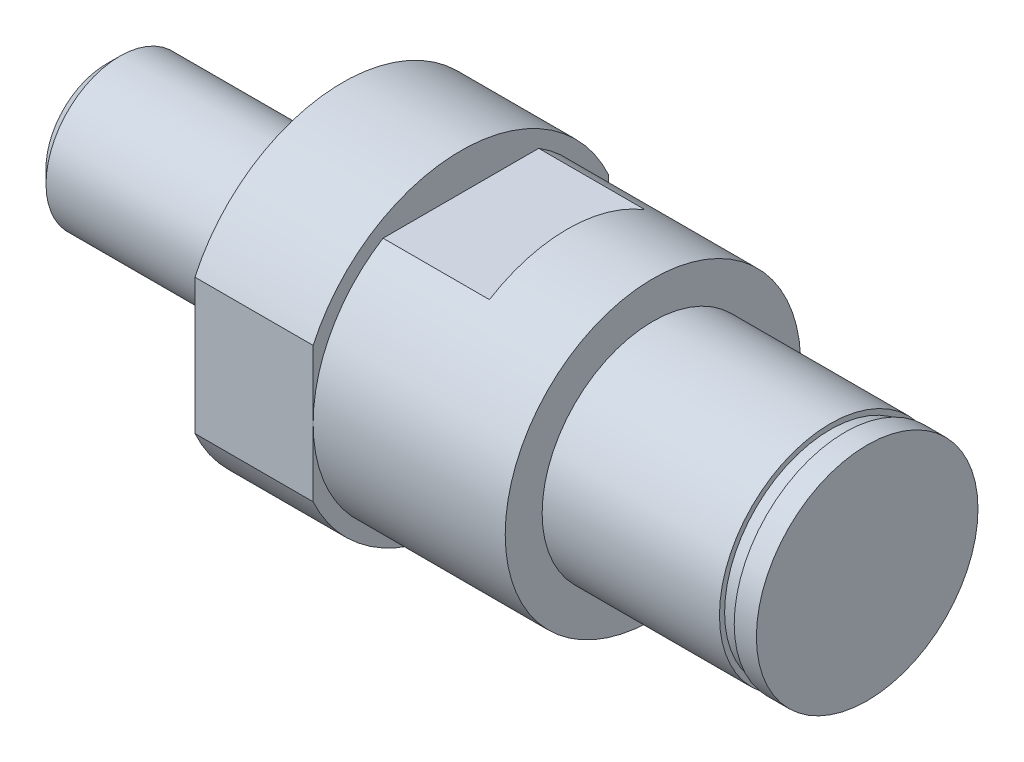
ISO-10303-21;
HEADER;
FILE_DESCRIPTION(('STEP AP214'),'2;1');
FILE_NAME('part.step','',(''),(''),'','','');
FILE_SCHEMA(('AUTOMOTIVE_DESIGN { 1 0 10303 214 1 1 1 1 }'));
ENDSEC;
DATA;
#1=APPLICATION_CONTEXT('core data for automotive mechanical design processes');
#2=APPLICATION_PROTOCOL_DEFINITION('international standard','automotive_design',2000,#1);
#3=PRODUCT_CONTEXT('',#1,'mechanical');
#4=PRODUCT('Part','Part','',(#3));
#5=PRODUCT_RELATED_PRODUCT_CATEGORY('part','',(#4));
#6=PRODUCT_DEFINITION_FORMATION('','',#4);
#7=PRODUCT_DEFINITION_CONTEXT('part definition',#1,'design');
#8=PRODUCT_DEFINITION('design','',#6,#7);
#9=PRODUCT_DEFINITION_SHAPE('','',#8);
#10=(LENGTH_UNIT() NAMED_UNIT(*) SI_UNIT(.MILLI.,.METRE.));
#11=(NAMED_UNIT(*) PLANE_ANGLE_UNIT() SI_UNIT($,.RADIAN.));
#12=(NAMED_UNIT(*) SI_UNIT($,.STERADIAN.) SOLID_ANGLE_UNIT());
#13=UNCERTAINTY_MEASURE_WITH_UNIT(LENGTH_MEASURE(1.E-05),#10,'distance_accuracy_value','');
#14=(GEOMETRIC_REPRESENTATION_CONTEXT(3) GLOBAL_UNCERTAINTY_ASSIGNED_CONTEXT((#13)) GLOBAL_UNIT_ASSIGNED_CONTEXT((#10,
#11,#12)) REPRESENTATION_CONTEXT('',''));
#15=CARTESIAN_POINT('',(0.,0.,0.));
#16=DIRECTION('',(0.,0.,1.));
#17=DIRECTION('',(1.,0.,0.));
#18=AXIS2_PLACEMENT_3D('',#15,#16,#17);
#19=CARTESIAN_POINT('',(51.5,7.5,0.));
#20=DIRECTION('',(-1.,0.,0.));
#21=DIRECTION('',(0.,0.,1.));
#22=AXIS2_PLACEMENT_3D('',#19,#20,#21);
#23=PLANE('',#22);
#24=CARTESIAN_POINT('',(51.5,0.,0.));
#25=DIRECTION('',(-1.,0.,0.));
#26=DIRECTION('',(0.,0.,1.));
#27=AXIS2_PLACEMENT_3D('',#24,#25,#26);
#28=CIRCLE('',#27,7.5);
#29=CARTESIAN_POINT('',(51.5,0.,7.5));
#30=VERTEX_POINT('',#29);
#31=EDGE_CURVE('E20',#30,#30,#28,.T.);
#32=ORIENTED_EDGE('',*,*,#31,.F.);
#33=EDGE_LOOP('',(#32));
#34=FACE_BOUND('',#33,.T.);
#35=ADVANCED_FACE('F17',(#34),#23,.F.);
#36=CARTESIAN_POINT('',(0.,0.,0.));
#37=DIRECTION('',(1.,0.,0.));
#38=DIRECTION('',(0.,0.,-1.));
#39=AXIS2_PLACEMENT_3D('',#36,#37,#38);
#40=PLANE('',#39);
#41=CARTESIAN_POINT('',(0.,0.,0.));
#42=DIRECTION('',(1.,0.,0.));
#43=DIRECTION('',(0.,1.,0.));
#44=AXIS2_PLACEMENT_3D('',#41,#42,#43);
#45=CIRCLE('',#44,4.07999999993081);
#46=CARTESIAN_POINT('',(0.,4.07999999993081,0.));
#47=VERTEX_POINT('',#46);
#48=EDGE_CURVE('E145',#47,#47,#45,.T.);
#49=ORIENTED_EDGE('',*,*,#48,.F.);
#50=EDGE_LOOP('',(#49));
#51=FACE_BOUND('',#50,.T.);
#52=ADVANCED_FACE('F156',(#51),#40,.F.);
#53=CARTESIAN_POINT('',(51.5,0.,0.));
#54=DIRECTION('',(-1.,0.,0.));
#55=DIRECTION('',(0.,0.,1.));
#56=AXIS2_PLACEMENT_3D('',#53,#54,#55);
#57=CYLINDRICAL_SURFACE('',#56,7.5);
#58=ORIENTED_EDGE('',*,*,#31,.T.);
#59=EDGE_LOOP('',(#58));
#60=FACE_BOUND('',#59,.T.);
#61=CARTESIAN_POINT('',(50.,0.,0.));
#62=DIRECTION('',(-1.,0.,0.));
#63=DIRECTION('',(0.,0.,1.));
#64=AXIS2_PLACEMENT_3D('',#61,#62,#63);
#65=CIRCLE('',#64,7.5);
#66=CARTESIAN_POINT('',(50.,0.,7.5));
#67=VERTEX_POINT('',#66);
#68=EDGE_CURVE('E98',#67,#67,#65,.F.);
#69=ORIENTED_EDGE('',*,*,#68,.T.);
#70=EDGE_LOOP('',(#69));
#71=FACE_BOUND('',#70,.T.);
#72=ADVANCED_FACE('F152',(#60,#71),#57,.T.);
#73=CARTESIAN_POINT('',(0.920000000007803,0.,0.));
#74=DIRECTION('',(1.,0.,0.));
#75=DIRECTION('',(0.,1.,0.));
#76=AXIS2_PLACEMENT_3D('',#73,#74,#75);
#77=CONICAL_SURFACE('',#76,4.99999999993861,0.785398163397448);
#78=CARTESIAN_POINT('',(0.919999999999997,0.,0.));
#79=DIRECTION('',(-1.,0.,0.));
#80=DIRECTION('',(0.,0.,1.));
#81=AXIS2_PLACEMENT_3D('',#78,#79,#80);
#82=CIRCLE('',#81,5.);
#83=CARTESIAN_POINT('',(0.919999999999997,0.,5.));
#84=VERTEX_POINT('',#83);
#85=EDGE_CURVE('E95',#84,#84,#82,.F.);
#86=ORIENTED_EDGE('',*,*,#85,.F.);
#87=EDGE_LOOP('',(#86));
#88=FACE_BOUND('',#87,.T.);
#89=ORIENTED_EDGE('',*,*,#48,.T.);
#90=EDGE_LOOP('',(#89));
#91=FACE_BOUND('',#90,.T.);
#92=ADVANCED_FACE('F232',(#88,#91),#77,.T.);
#93=CARTESIAN_POINT('',(50.,7.15,0.));
#94=DIRECTION('',(1.,0.,0.));
#95=DIRECTION('',(0.,0.,-1.));
#96=AXIS2_PLACEMENT_3D('',#93,#94,#95);
#97=PLANE('',#96);
#98=ORIENTED_EDGE('',*,*,#68,.F.);
#99=EDGE_LOOP('',(#98));
#100=FACE_BOUND('',#99,.T.);
#101=CARTESIAN_POINT('',(50.,0.,0.));
#102=DIRECTION('',(-1.,0.,0.));
#103=DIRECTION('',(0.,0.,1.));
#104=AXIS2_PLACEMENT_3D('',#101,#102,#103);
#105=CIRCLE('',#104,7.15);
#106=CARTESIAN_POINT('',(50.,0.,7.15));
#107=VERTEX_POINT('',#106);
#108=EDGE_CURVE('E97',#107,#107,#105,.T.);
#109=ORIENTED_EDGE('',*,*,#108,.F.);
#110=EDGE_LOOP('',(#109));
#111=FACE_BOUND('',#110,.T.);
#112=ADVANCED_FACE('F228',(#100,#111),#97,.F.);
#113=CARTESIAN_POINT('',(56.5,0.,0.));
#114=DIRECTION('',(-1.,0.,0.));
#115=DIRECTION('',(0.,0.,1.));
#116=AXIS2_PLACEMENT_3D('',#113,#114,#115);
#117=CYLINDRICAL_SURFACE('',#116,5.);
#118=CARTESIAN_POINT('',(16.,0.,0.));
#119=DIRECTION('',(-1.,0.,0.));
#120=DIRECTION('',(0.,0.,1.));
#121=AXIS2_PLACEMENT_3D('',#118,#119,#120);
#122=CIRCLE('',#121,5.);
#123=CARTESIAN_POINT('',(16.,0.,5.));
#124=VERTEX_POINT('',#123);
#125=EDGE_CURVE('E139',#124,#124,#122,.T.);
#126=ORIENTED_EDGE('',*,*,#125,.T.);
#127=EDGE_LOOP('',(#126));
#128=FACE_BOUND('',#127,.T.);
#129=ORIENTED_EDGE('',*,*,#85,.T.);
#130=EDGE_LOOP('',(#129));
#131=FACE_BOUND('',#130,.T.);
#132=ADVANCED_FACE('F224',(#128,#131),#117,.T.);
#133=CARTESIAN_POINT('',(51.5,0.,0.));
#134=DIRECTION('',(-1.,0.,0.));
#135=DIRECTION('',(0.,0.,1.));
#136=AXIS2_PLACEMENT_3D('',#133,#134,#135);
#137=CYLINDRICAL_SURFACE('',#136,7.15);
#138=ORIENTED_EDGE('',*,*,#108,.T.);
#139=EDGE_LOOP('',(#138));
#140=FACE_BOUND('',#139,.T.);
#141=CARTESIAN_POINT('',(49.,0.,0.));
#142=DIRECTION('',(-1.,0.,0.));
#143=DIRECTION('',(0.,0.,1.));
#144=AXIS2_PLACEMENT_3D('',#141,#142,#143);
#145=CIRCLE('',#144,7.15);
#146=CARTESIAN_POINT('',(49.,0.,7.15));
#147=VERTEX_POINT('',#146);
#148=EDGE_CURVE('E79',#147,#147,#145,.F.);
#149=ORIENTED_EDGE('',*,*,#148,.T.);
#150=EDGE_LOOP('',(#149));
#151=FACE_BOUND('',#150,.T.);
#152=ADVANCED_FACE('F220',(#140,#151),#137,.T.);
#153=CARTESIAN_POINT('',(16.,5.,0.));
#154=DIRECTION('',(1.,0.,0.));
#155=DIRECTION('',(0.,0.,-1.));
#156=AXIS2_PLACEMENT_3D('',#153,#154,#155);
#157=PLANE('',#156);
#158=ORIENTED_EDGE('',*,*,#125,.F.);
#159=EDGE_LOOP('',(#158));
#160=FACE_BOUND('',#159,.T.);
#161=DIRECTION('',(0.,1.,0.));
#162=VECTOR('',#161,1.);
#163=CARTESIAN_POINT('',(16.,-4.58257569495584,-10.));
#164=LINE('',#163,#162);
#165=CARTESIAN_POINT('',(16.,-4.58257569495584,-10.));
#166=VERTEX_POINT('',#165);
#167=CARTESIAN_POINT('',(16.,4.58257569495584,-10.));
#168=VERTEX_POINT('',#167);
#169=EDGE_CURVE('E73',#166,#168,#164,.T.);
#170=ORIENTED_EDGE('',*,*,#169,.F.);
#171=CARTESIAN_POINT('',(16.,0.,0.));
#172=DIRECTION('',(-1.,0.,0.));
#173=DIRECTION('',(0.,0.,1.));
#174=AXIS2_PLACEMENT_3D('',#171,#172,#173);
#175=CIRCLE('',#174,11.);
#176=CARTESIAN_POINT('',(16.,-4.58257569495584,10.));
#177=VERTEX_POINT('',#176);
#178=EDGE_CURVE('E85',#177,#166,#175,.F.);
#179=ORIENTED_EDGE('',*,*,#178,.F.);
#180=DIRECTION('',(0.,1.,0.));
#181=VECTOR('',#180,1.);
#182=CARTESIAN_POINT('',(16.,4.58257569495584,10.));
#183=LINE('',#182,#181);
#184=CARTESIAN_POINT('',(16.,4.58257569495584,10.));
#185=VERTEX_POINT('',#184);
#186=EDGE_CURVE('E76',#185,#177,#183,.F.);
#187=ORIENTED_EDGE('',*,*,#186,.F.);
#188=CARTESIAN_POINT('',(16.,0.,0.));
#189=DIRECTION('',(-1.,0.,0.));
#190=DIRECTION('',(0.,0.,1.));
#191=AXIS2_PLACEMENT_3D('',#188,#189,#190);
#192=CIRCLE('',#191,11.);
#193=EDGE_CURVE('E69',#168,#185,#192,.F.);
#194=ORIENTED_EDGE('',*,*,#193,.F.);
#195=EDGE_LOOP('',(#170,#179,#187,#194));
#196=FACE_BOUND('',#195,.T.);
#197=ADVANCED_FACE('F71',(#160,#196),#157,.F.);
#198=CARTESIAN_POINT('',(49.,7.5,0.));
#199=DIRECTION('',(-1.,0.,0.));
#200=DIRECTION('',(0.,0.,1.));
#201=AXIS2_PLACEMENT_3D('',#198,#199,#200);
#202=PLANE('',#201);
#203=CARTESIAN_POINT('',(49.,0.,0.));
#204=DIRECTION('',(-1.,0.,0.));
#205=DIRECTION('',(0.,0.,1.));
#206=AXIS2_PLACEMENT_3D('',#203,#204,#205);
#207=CIRCLE('',#206,7.5);
#208=CARTESIAN_POINT('',(49.,0.,7.5));
#209=VERTEX_POINT('',#208);
#210=EDGE_CURVE('E131',#209,#209,#207,.T.);
#211=ORIENTED_EDGE('',*,*,#210,.F.);
#212=EDGE_LOOP('',(#211));
#213=FACE_BOUND('',#212,.T.);
#214=ORIENTED_EDGE('',*,*,#148,.F.);
#215=EDGE_LOOP('',(#214));
#216=FACE_BOUND('',#215,.T.);
#217=ADVANCED_FACE('F214',(#213,#216),#202,.F.);
#218=CARTESIAN_POINT('',(56.5,0.,0.));
#219=DIRECTION('',(-1.,0.,0.));
#220=DIRECTION('',(0.,0.,1.));
#221=AXIS2_PLACEMENT_3D('',#218,#219,#220);
#222=CYLINDRICAL_SURFACE('',#221,11.);
#223=DIRECTION('',(1.,0.,0.));
#224=VECTOR('',#223,1.);
#225=CARTESIAN_POINT('',(16.,4.58257569495584,10.));
#226=LINE('',#225,#224);
#227=CARTESIAN_POINT('',(24.,4.58257569495584,10.));
#228=VERTEX_POINT('',#227);
#229=EDGE_CURVE('E389',#228,#185,#226,.F.);
#230=ORIENTED_EDGE('',*,*,#229,.F.);
#231=CARTESIAN_POINT('',(24.,0.,0.));
#232=DIRECTION('',(-1.,0.,0.));
#233=DIRECTION('',(0.,0.,1.));
#234=AXIS2_PLACEMENT_3D('',#231,#232,#233);
#235=CIRCLE('',#234,11.);
#236=CARTESIAN_POINT('',(24.,4.58257569495584,-10.));
#237=VERTEX_POINT('',#236);
#238=EDGE_CURVE('E84',#228,#237,#235,.T.);
#239=ORIENTED_EDGE('',*,*,#238,.T.);
#240=DIRECTION('',(-1.,0.,0.));
#241=VECTOR('',#240,1.);
#242=CARTESIAN_POINT('',(16.,4.58257569495584,-10.));
#243=LINE('',#242,#241);
#244=EDGE_CURVE('E81',#168,#237,#243,.F.);
#245=ORIENTED_EDGE('',*,*,#244,.F.);
#246=ORIENTED_EDGE('',*,*,#193,.T.);
#247=EDGE_LOOP('',(#230,#239,#245,#246));
#248=FACE_BOUND('',#247,.T.);
#249=ADVANCED_FACE('F82',(#248),#222,.T.);
#250=CARTESIAN_POINT('',(16.,-4.58257569495584,-10.));
#251=DIRECTION('',(0.,0.,-1.));
#252=DIRECTION('',(-1.,0.,0.));
#253=AXIS2_PLACEMENT_3D('',#250,#251,#252);
#254=PLANE('',#253);
#255=ORIENTED_EDGE('',*,*,#244,.T.);
#256=DIRECTION('',(0.,1.,0.));
#257=VECTOR('',#256,1.);
#258=CARTESIAN_POINT('',(24.,11.,-10.));
#259=LINE('',#258,#257);
#260=CARTESIAN_POINT('',(24.,0.,-10.));
#261=VERTEX_POINT('',#260);
#262=EDGE_CURVE('E35',#237,#261,#259,.F.);
#263=ORIENTED_EDGE('',*,*,#262,.T.);
#264=DIRECTION('',(0.,1.,0.));
#265=VECTOR('',#264,1.);
#266=CARTESIAN_POINT('',(24.,11.,-10.));
#267=LINE('',#266,#265);
#268=CARTESIAN_POINT('',(24.,-4.58257569495584,-10.));
#269=VERTEX_POINT('',#268);
#270=EDGE_CURVE('E128',#261,#269,#267,.F.);
#271=ORIENTED_EDGE('',*,*,#270,.T.);
#272=DIRECTION('',(-1.,0.,0.));
#273=VECTOR('',#272,1.);
#274=CARTESIAN_POINT('',(56.5,-4.58257569495584,-10.));
#275=LINE('',#274,#273);
#276=EDGE_CURVE('E89',#166,#269,#275,.F.);
#277=ORIENTED_EDGE('',*,*,#276,.F.);
#278=ORIENTED_EDGE('',*,*,#169,.T.);
#279=EDGE_LOOP('',(#255,#263,#271,#277,#278));
#280=FACE_BOUND('',#279,.T.);
#281=ADVANCED_FACE('F87',(#280),#254,.T.);
#282=CARTESIAN_POINT('',(56.5,0.,0.));
#283=DIRECTION('',(-1.,0.,0.));
#284=DIRECTION('',(0.,0.,1.));
#285=AXIS2_PLACEMENT_3D('',#282,#283,#284);
#286=CYLINDRICAL_SURFACE('',#285,11.);
#287=ORIENTED_EDGE('',*,*,#276,.T.);
#288=CARTESIAN_POINT('',(24.,0.,0.));
#289=DIRECTION('',(-1.,0.,0.));
#290=DIRECTION('',(0.,0.,1.));
#291=AXIS2_PLACEMENT_3D('',#288,#289,#290);
#292=CIRCLE('',#291,11.);
#293=CARTESIAN_POINT('',(24.,-4.58257569495584,10.));
#294=VERTEX_POINT('',#293);
#295=EDGE_CURVE('E125',#269,#294,#292,.T.);
#296=ORIENTED_EDGE('',*,*,#295,.T.);
#297=DIRECTION('',(1.,0.,0.));
#298=VECTOR('',#297,1.);
#299=CARTESIAN_POINT('',(16.,-4.58257569495584,10.));
#300=LINE('',#299,#298);
#301=EDGE_CURVE('E135',#177,#294,#300,.T.);
#302=ORIENTED_EDGE('',*,*,#301,.F.);
#303=ORIENTED_EDGE('',*,*,#178,.T.);
#304=EDGE_LOOP('',(#287,#296,#302,#303));
#305=FACE_BOUND('',#304,.T.);
#306=ADVANCED_FACE('F205',(#305),#286,.T.);
#307=CARTESIAN_POINT('',(16.,4.58257569495584,10.));
#308=DIRECTION('',(0.,0.,1.));
#309=DIRECTION('',(1.,0.,0.));
#310=AXIS2_PLACEMENT_3D('',#307,#308,#309);
#311=PLANE('',#310);
#312=ORIENTED_EDGE('',*,*,#301,.T.);
#313=DIRECTION('',(0.,1.,0.));
#314=VECTOR('',#313,1.);
#315=CARTESIAN_POINT('',(24.,11.,10.));
#316=LINE('',#315,#314);
#317=CARTESIAN_POINT('',(24.,0.,10.));
#318=VERTEX_POINT('',#317);
#319=EDGE_CURVE('E127',#294,#318,#316,.T.);
#320=ORIENTED_EDGE('',*,*,#319,.T.);
#321=DIRECTION('',(0.,1.,0.));
#322=VECTOR('',#321,1.);
#323=CARTESIAN_POINT('',(24.,11.,10.));
#324=LINE('',#323,#322);
#325=EDGE_CURVE('E130',#318,#228,#324,.T.);
#326=ORIENTED_EDGE('',*,*,#325,.T.);
#327=ORIENTED_EDGE('',*,*,#229,.T.);
#328=ORIENTED_EDGE('',*,*,#186,.T.);
#329=EDGE_LOOP('',(#312,#320,#326,#327,#328));
#330=FACE_BOUND('',#329,.T.);
#331=ADVANCED_FACE('F201',(#330),#311,.T.);
#332=CARTESIAN_POINT('',(56.5,0.,0.));
#333=DIRECTION('',(-1.,0.,0.));
#334=DIRECTION('',(0.,0.,1.));
#335=AXIS2_PLACEMENT_3D('',#332,#333,#334);
#336=CYLINDRICAL_SURFACE('',#335,7.5);
#337=ORIENTED_EDGE('',*,*,#210,.T.);
#338=EDGE_LOOP('',(#337));
#339=FACE_BOUND('',#338,.T.);
#340=CARTESIAN_POINT('',(37.,0.,0.));
#341=DIRECTION('',(-1.,0.,0.));
#342=DIRECTION('',(0.,0.,1.));
#343=AXIS2_PLACEMENT_3D('',#340,#341,#342);
#344=CIRCLE('',#343,7.5);
#345=CARTESIAN_POINT('',(37.,0.,7.5));
#346=VERTEX_POINT('',#345);
#347=EDGE_CURVE('E121',#346,#346,#344,.F.);
#348=ORIENTED_EDGE('',*,*,#347,.T.);
#349=EDGE_LOOP('',(#348));
#350=FACE_BOUND('',#349,.T.);
#351=ADVANCED_FACE('F197',(#339,#350),#336,.T.);
#352=CARTESIAN_POINT('',(31.2,8.5,10.));
#353=DIRECTION('',(-1.,0.,0.));
#354=DIRECTION('',(0.,0.,1.));
#355=AXIS2_PLACEMENT_3D('',#352,#353,#354);
#356=PLANE('',#355);
#357=DIRECTION('',(0.,0.,1.));
#358=VECTOR('',#357,1.);
#359=CARTESIAN_POINT('',(31.2,8.5,10.));
#360=LINE('',#359,#358);
#361=CARTESIAN_POINT('',(31.2,8.5,5.26782687642637));
#362=VERTEX_POINT('',#361);
#363=CARTESIAN_POINT('',(31.2,8.5,-5.26782687642637));
#364=VERTEX_POINT('',#363);
#365=EDGE_CURVE('E134',#362,#364,#360,.F.);
#366=ORIENTED_EDGE('',*,*,#365,.F.);
#367=CARTESIAN_POINT('',(31.2,0.,0.));
#368=DIRECTION('',(-1.,0.,0.));
#369=DIRECTION('',(0.,0.,1.));
#370=AXIS2_PLACEMENT_3D('',#367,#368,#369);
#371=CIRCLE('',#370,10.);
#372=EDGE_CURVE('E114',#364,#362,#371,.F.);
#373=ORIENTED_EDGE('',*,*,#372,.F.);
#374=EDGE_LOOP('',(#366,#373));
#375=FACE_BOUND('',#374,.T.);
#376=ADVANCED_FACE('F193',(#375),#356,.T.);
#377=CARTESIAN_POINT('',(24.,8.5,10.));
#378=DIRECTION('',(0.,1.,0.));
#379=DIRECTION('',(0.,0.,1.));
#380=AXIS2_PLACEMENT_3D('',#377,#378,#379);
#381=PLANE('',#380);
#382=DIRECTION('',(-1.,0.,0.));
#383=VECTOR('',#382,1.);
#384=CARTESIAN_POINT('',(56.5,8.5,-5.26782687642637));
#385=LINE('',#384,#383);
#386=CARTESIAN_POINT('',(24.,8.5,-5.26782687642637));
#387=VERTEX_POINT('',#386);
#388=EDGE_CURVE('E117',#387,#364,#385,.F.);
#389=ORIENTED_EDGE('',*,*,#388,.F.);
#390=DIRECTION('',(0.,0.,1.));
#391=VECTOR('',#390,1.);
#392=CARTESIAN_POINT('',(24.,8.5,0.));
#393=LINE('',#392,#391);
#394=CARTESIAN_POINT('',(24.,8.5,5.26782687642637));
#395=VERTEX_POINT('',#394);
#396=EDGE_CURVE('E413',#387,#395,#393,.T.);
#397=ORIENTED_EDGE('',*,*,#396,.T.);
#398=DIRECTION('',(-1.,0.,0.));
#399=VECTOR('',#398,1.);
#400=CARTESIAN_POINT('',(56.5,8.5,5.26782687642637));
#401=LINE('',#400,#399);
#402=EDGE_CURVE('E113',#362,#395,#401,.T.);
#403=ORIENTED_EDGE('',*,*,#402,.F.);
#404=ORIENTED_EDGE('',*,*,#365,.T.);
#405=EDGE_LOOP('',(#389,#397,#403,#404));
#406=FACE_BOUND('',#405,.T.);
#407=ADVANCED_FACE('F189',(#406),#381,.T.);
#408=CARTESIAN_POINT('',(24.,11.,0.));
#409=DIRECTION('',(-1.,0.,0.));
#410=DIRECTION('',(0.,0.,1.));
#411=AXIS2_PLACEMENT_3D('',#408,#409,#410);
#412=PLANE('',#411);
#413=ORIENTED_EDGE('',*,*,#238,.F.);
#414=ORIENTED_EDGE('',*,*,#325,.F.);
#415=CARTESIAN_POINT('',(24.,0.,0.));
#416=DIRECTION('',(-1.,0.,0.));
#417=DIRECTION('',(0.,0.,1.));
#418=AXIS2_PLACEMENT_3D('',#415,#416,#417);
#419=CIRCLE('',#418,10.);
#420=EDGE_CURVE('E110',#395,#318,#419,.F.);
#421=ORIENTED_EDGE('',*,*,#420,.F.);
#422=ORIENTED_EDGE('',*,*,#396,.F.);
#423=CARTESIAN_POINT('',(24.,0.,0.));
#424=DIRECTION('',(-1.,0.,0.));
#425=DIRECTION('',(0.,0.,1.));
#426=AXIS2_PLACEMENT_3D('',#423,#424,#425);
#427=CIRCLE('',#426,10.);
#428=EDGE_CURVE('E118',#261,#387,#427,.F.);
#429=ORIENTED_EDGE('',*,*,#428,.F.);
#430=ORIENTED_EDGE('',*,*,#262,.F.);
#431=EDGE_LOOP('',(#413,#414,#421,#422,#429,#430));
#432=FACE_BOUND('',#431,.T.);
#433=ADVANCED_FACE('F185',(#432),#412,.F.);
#434=CARTESIAN_POINT('',(31.2,-10.,10.));
#435=DIRECTION('',(-1.,0.,0.));
#436=DIRECTION('',(0.,0.,1.));
#437=AXIS2_PLACEMENT_3D('',#434,#435,#436);
#438=PLANE('',#437);
#439=DIRECTION('',(0.,0.,-1.));
#440=VECTOR('',#439,1.);
#441=CARTESIAN_POINT('',(31.2,-8.5,10.));
#442=LINE('',#441,#440);
#443=CARTESIAN_POINT('',(31.2,-8.5,-5.26782687642637));
#444=VERTEX_POINT('',#443);
#445=CARTESIAN_POINT('',(31.2,-8.5,5.26782687642637));
#446=VERTEX_POINT('',#445);
#447=EDGE_CURVE('E404',#444,#446,#442,.F.);
#448=ORIENTED_EDGE('',*,*,#447,.F.);
#449=CARTESIAN_POINT('',(31.2,0.,0.));
#450=DIRECTION('',(-1.,0.,0.));
#451=DIRECTION('',(0.,0.,1.));
#452=AXIS2_PLACEMENT_3D('',#449,#450,#451);
#453=CIRCLE('',#452,10.);
#454=EDGE_CURVE('E103',#446,#444,#453,.F.);
#455=ORIENTED_EDGE('',*,*,#454,.F.);
#456=EDGE_LOOP('',(#448,#455));
#457=FACE_BOUND('',#456,.T.);
#458=ADVANCED_FACE('F181',(#457),#438,.T.);
#459=CARTESIAN_POINT('',(31.2,-8.5,10.));
#460=DIRECTION('',(0.,-1.,0.));
#461=DIRECTION('',(0.,0.,-1.));
#462=AXIS2_PLACEMENT_3D('',#459,#460,#461);
#463=PLANE('',#462);
#464=DIRECTION('',(-1.,0.,0.));
#465=VECTOR('',#464,1.);
#466=CARTESIAN_POINT('',(56.5,-8.5,5.26782687642636));
#467=LINE('',#466,#465);
#468=CARTESIAN_POINT('',(24.,-8.5,5.26782687642637));
#469=VERTEX_POINT('',#468);
#470=EDGE_CURVE('E106',#469,#446,#467,.F.);
#471=ORIENTED_EDGE('',*,*,#470,.F.);
#472=DIRECTION('',(0.,0.,1.));
#473=VECTOR('',#472,1.);
#474=CARTESIAN_POINT('',(24.,-8.5,0.));
#475=LINE('',#474,#473);
#476=CARTESIAN_POINT('',(24.,-8.5,-5.26782687642637));
#477=VERTEX_POINT('',#476);
#478=EDGE_CURVE('E124',#469,#477,#475,.F.);
#479=ORIENTED_EDGE('',*,*,#478,.T.);
#480=DIRECTION('',(-1.,0.,0.));
#481=VECTOR('',#480,1.);
#482=CARTESIAN_POINT('',(56.5,-8.5,-5.26782687642637));
#483=LINE('',#482,#481);
#484=EDGE_CURVE('E102',#444,#477,#483,.T.);
#485=ORIENTED_EDGE('',*,*,#484,.F.);
#486=ORIENTED_EDGE('',*,*,#447,.T.);
#487=EDGE_LOOP('',(#471,#479,#485,#486));
#488=FACE_BOUND('',#487,.T.);
#489=ADVANCED_FACE('F177',(#488),#463,.T.);
#490=CARTESIAN_POINT('',(24.,11.,0.));
#491=DIRECTION('',(-1.,0.,0.));
#492=DIRECTION('',(0.,0.,1.));
#493=AXIS2_PLACEMENT_3D('',#490,#491,#492);
#494=PLANE('',#493);
#495=ORIENTED_EDGE('',*,*,#478,.F.);
#496=CARTESIAN_POINT('',(24.,0.,0.));
#497=DIRECTION('',(-1.,0.,0.));
#498=DIRECTION('',(0.,0.,1.));
#499=AXIS2_PLACEMENT_3D('',#496,#497,#498);
#500=CIRCLE('',#499,10.);
#501=EDGE_CURVE('E107',#318,#469,#500,.F.);
#502=ORIENTED_EDGE('',*,*,#501,.F.);
#503=ORIENTED_EDGE('',*,*,#319,.F.);
#504=ORIENTED_EDGE('',*,*,#295,.F.);
#505=ORIENTED_EDGE('',*,*,#270,.F.);
#506=CARTESIAN_POINT('',(24.,0.,0.));
#507=DIRECTION('',(-1.,0.,0.));
#508=DIRECTION('',(0.,0.,1.));
#509=AXIS2_PLACEMENT_3D('',#506,#507,#508);
#510=CIRCLE('',#509,10.);
#511=EDGE_CURVE('E26',#477,#261,#510,.F.);
#512=ORIENTED_EDGE('',*,*,#511,.F.);
#513=EDGE_LOOP('',(#495,#502,#503,#504,#505,#512));
#514=FACE_BOUND('',#513,.T.);
#515=ADVANCED_FACE('F170',(#514),#494,.F.);
#516=CARTESIAN_POINT('',(37.,10.,0.));
#517=DIRECTION('',(-1.,0.,0.));
#518=DIRECTION('',(0.,0.,1.));
#519=AXIS2_PLACEMENT_3D('',#516,#517,#518);
#520=PLANE('',#519);
#521=CARTESIAN_POINT('',(37.,0.,0.));
#522=DIRECTION('',(-1.,0.,0.));
#523=DIRECTION('',(0.,0.,1.));
#524=AXIS2_PLACEMENT_3D('',#521,#522,#523);
#525=CIRCLE('',#524,10.);
#526=CARTESIAN_POINT('',(37.,0.,10.));
#527=VERTEX_POINT('',#526);
#528=EDGE_CURVE('E11',#527,#527,#525,.T.);
#529=ORIENTED_EDGE('',*,*,#528,.F.);
#530=EDGE_LOOP('',(#529));
#531=FACE_BOUND('',#530,.T.);
#532=ORIENTED_EDGE('',*,*,#347,.F.);
#533=EDGE_LOOP('',(#532));
#534=FACE_BOUND('',#533,.T.);
#535=ADVANCED_FACE('F164',(#531,#534),#520,.F.);
#536=CARTESIAN_POINT('',(56.5,0.,0.));
#537=DIRECTION('',(-1.,0.,0.));
#538=DIRECTION('',(0.,0.,1.));
#539=AXIS2_PLACEMENT_3D('',#536,#537,#538);
#540=CYLINDRICAL_SURFACE('',#539,10.);
#541=ORIENTED_EDGE('',*,*,#528,.T.);
#542=EDGE_LOOP('',(#541));
#543=FACE_BOUND('',#542,.T.);
#544=ORIENTED_EDGE('',*,*,#511,.T.);
#545=ORIENTED_EDGE('',*,*,#428,.T.);
#546=ORIENTED_EDGE('',*,*,#388,.T.);
#547=ORIENTED_EDGE('',*,*,#372,.T.);
#548=ORIENTED_EDGE('',*,*,#402,.T.);
#549=ORIENTED_EDGE('',*,*,#420,.T.);
#550=ORIENTED_EDGE('',*,*,#501,.T.);
#551=ORIENTED_EDGE('',*,*,#470,.T.);
#552=ORIENTED_EDGE('',*,*,#454,.T.);
#553=ORIENTED_EDGE('',*,*,#484,.T.);
#554=EDGE_LOOP('',(#544,#545,#546,#547,#548,#549,#550,#551,#552,#553));
#555=FACE_BOUND('',#554,.T.);
#556=ADVANCED_FACE('F162',(#543,#555),#540,.T.);
#557=CLOSED_SHELL('',(#35,#52,#72,#92,#112,#132,#152,#197,#217,#249,#281,#306,#331,#351,#376,
#407,#433,#458,#489,#515,#535,#556));
#558=MANIFOLD_SOLID_BREP('B1',#557);
#559=ADVANCED_BREP_SHAPE_REPRESENTATION('',(#18,#558),#14);
#560=SHAPE_DEFINITION_REPRESENTATION(#9,#559);
ENDSEC;
END-ISO-10303-21;
